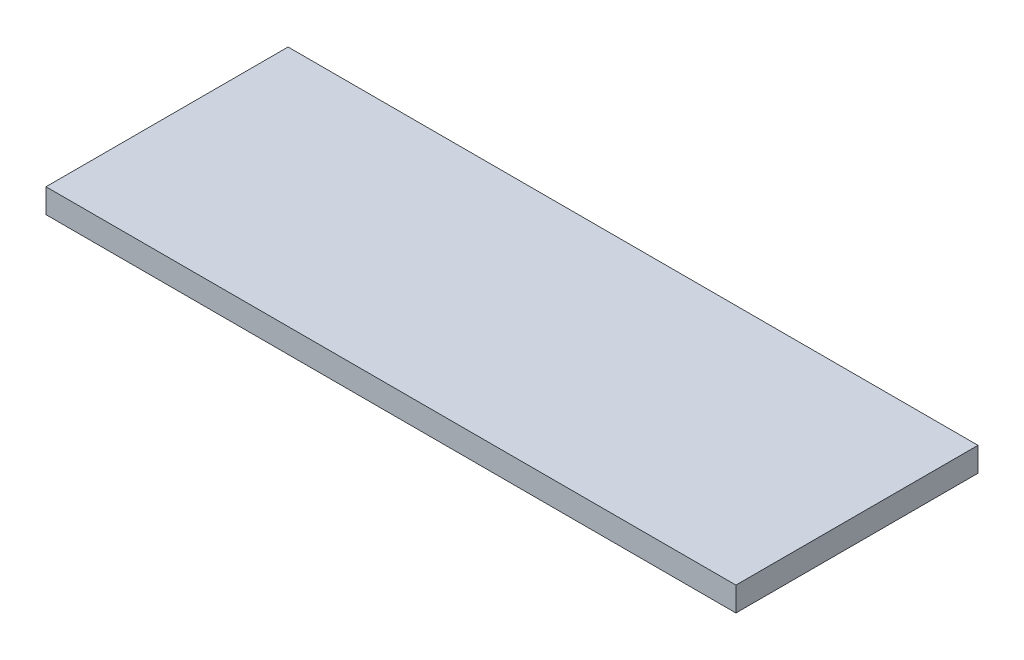
ISO-10303-21;
HEADER;
FILE_DESCRIPTION(('STEP AP214'),'2;1');
FILE_NAME('part.step','',(''),(''),'','','');
FILE_SCHEMA(('AUTOMOTIVE_DESIGN { 1 0 10303 214 1 1 1 1 }'));
ENDSEC;
DATA;
#1=APPLICATION_CONTEXT('core data for automotive mechanical design processes');
#2=APPLICATION_PROTOCOL_DEFINITION('international standard','automotive_design',2000,#1);
#3=PRODUCT_CONTEXT('',#1,'mechanical');
#4=PRODUCT('Part','Part','',(#3));
#5=PRODUCT_RELATED_PRODUCT_CATEGORY('part','',(#4));
#6=PRODUCT_DEFINITION_FORMATION('','',#4);
#7=PRODUCT_DEFINITION_CONTEXT('part definition',#1,'design');
#8=PRODUCT_DEFINITION('design','',#6,#7);
#9=PRODUCT_DEFINITION_SHAPE('','',#8);
#10=(LENGTH_UNIT() NAMED_UNIT(*) SI_UNIT(.MILLI.,.METRE.));
#11=(NAMED_UNIT(*) PLANE_ANGLE_UNIT() SI_UNIT($,.RADIAN.));
#12=(NAMED_UNIT(*) SI_UNIT($,.STERADIAN.) SOLID_ANGLE_UNIT());
#13=UNCERTAINTY_MEASURE_WITH_UNIT(LENGTH_MEASURE(1.E-05),#10,'distance_accuracy_value','');
#14=(GEOMETRIC_REPRESENTATION_CONTEXT(3) GLOBAL_UNCERTAINTY_ASSIGNED_CONTEXT((#13)) GLOBAL_UNIT_ASSIGNED_CONTEXT((#10,
#11,#12)) REPRESENTATION_CONTEXT('',''));
#15=CARTESIAN_POINT('',(0.,0.,0.));
#16=DIRECTION('',(0.,0.,1.));
#17=DIRECTION('',(1.,0.,0.));
#18=AXIS2_PLACEMENT_3D('',#15,#16,#17);
#19=CARTESIAN_POINT('',(-15.8111111111111,14.3555555555555,5.25));
#20=DIRECTION('',(1.,0.,0.));
#21=DIRECTION('',(0.,1.,0.));
#22=AXIS2_PLACEMENT_3D('',#19,#20,#21);
#23=PLANE('',#22);
#24=DIRECTION('',(0.,0.,-1.));
#25=VECTOR('',#24,1.);
#26=CARTESIAN_POINT('',(-15.8111111111111,15.3555555555555,5.25));
#27=LINE('',#26,#25);
#28=CARTESIAN_POINT('',(-15.8111111111111,15.3555555555555,5.25));
#29=VERTEX_POINT('',#28);
#30=CARTESIAN_POINT('',(-15.8111111111111,15.3555555555556,-4.75));
#31=VERTEX_POINT('',#30);
#32=EDGE_CURVE('E98',#29,#31,#27,.T.);
#33=ORIENTED_EDGE('',*,*,#32,.T.);
#34=DIRECTION('',(0.,1.,0.));
#35=VECTOR('',#34,1.);
#36=CARTESIAN_POINT('',(-15.8111111111111,14.3555555555556,-4.75));
#37=LINE('',#36,#35);
#38=CARTESIAN_POINT('',(-15.8111111111111,14.3555555555556,-4.75));
#39=VERTEX_POINT('',#38);
#40=EDGE_CURVE('E11',#39,#31,#37,.T.);
#41=ORIENTED_EDGE('',*,*,#40,.F.);
#42=DIRECTION('',(0.,0.,-1.));
#43=VECTOR('',#42,1.);
#44=CARTESIAN_POINT('',(-15.8111111111111,14.3555555555555,5.25));
#45=LINE('',#44,#43);
#46=CARTESIAN_POINT('',(-15.8111111111111,14.3555555555555,5.25));
#47=VERTEX_POINT('',#46);
#48=EDGE_CURVE('E86',#47,#39,#45,.T.);
#49=ORIENTED_EDGE('',*,*,#48,.F.);
#50=DIRECTION('',(0.,1.,0.));
#51=VECTOR('',#50,1.);
#52=CARTESIAN_POINT('',(-15.8111111111111,14.3555555555555,5.25));
#53=LINE('',#52,#51);
#54=EDGE_CURVE('E94',#47,#29,#53,.T.);
#55=ORIENTED_EDGE('',*,*,#54,.T.);
#56=EDGE_LOOP('',(#33,#41,#49,#55));
#57=FACE_BOUND('',#56,.T.);
#58=ADVANCED_FACE('F35',(#57),#23,.F.);
#59=CARTESIAN_POINT('',(-15.8111111111111,14.3555555555556,-4.75));
#60=DIRECTION('',(0.,0.,1.));
#61=DIRECTION('',(0.,-1.,0.));
#62=AXIS2_PLACEMENT_3D('',#59,#60,#61);
#63=PLANE('',#62);
#64=DIRECTION('',(1.,0.,0.));
#65=VECTOR('',#64,1.);
#66=CARTESIAN_POINT('',(-15.8111111111111,15.3555555555556,-4.75));
#67=LINE('',#66,#65);
#68=CARTESIAN_POINT('',(12.6888888888889,15.3555555555556,-4.75));
#69=VERTEX_POINT('',#68);
#70=EDGE_CURVE('E90',#31,#69,#67,.T.);
#71=ORIENTED_EDGE('',*,*,#70,.T.);
#72=DIRECTION('',(0.,1.,0.));
#73=VECTOR('',#72,1.);
#74=CARTESIAN_POINT('',(12.6888888888889,14.3555555555556,-4.75));
#75=LINE('',#74,#73);
#76=CARTESIAN_POINT('',(12.6888888888889,14.3555555555556,-4.75));
#77=VERTEX_POINT('',#76);
#78=EDGE_CURVE('E43',#77,#69,#75,.T.);
#79=ORIENTED_EDGE('',*,*,#78,.F.);
#80=DIRECTION('',(1.,0.,0.));
#81=VECTOR('',#80,1.);
#82=CARTESIAN_POINT('',(-15.8111111111111,14.3555555555556,-4.75));
#83=LINE('',#82,#81);
#84=EDGE_CURVE('E81',#39,#77,#83,.T.);
#85=ORIENTED_EDGE('',*,*,#84,.F.);
#86=ORIENTED_EDGE('',*,*,#40,.T.);
#87=EDGE_LOOP('',(#71,#79,#85,#86));
#88=FACE_BOUND('',#87,.T.);
#89=ADVANCED_FACE('F89',(#88),#63,.F.);
#90=CARTESIAN_POINT('',(12.6888888888889,14.3555555555555,5.25));
#91=DIRECTION('',(-1.,0.,0.));
#92=DIRECTION('',(0.,0.,-1.));
#93=AXIS2_PLACEMENT_3D('',#90,#91,#92);
#94=PLANE('',#93);
#95=DIRECTION('',(0.,0.,1.));
#96=VECTOR('',#95,1.);
#97=CARTESIAN_POINT('',(12.6888888888889,15.3555555555555,5.25));
#98=LINE('',#97,#96);
#99=CARTESIAN_POINT('',(12.6888888888889,15.3555555555555,5.25));
#100=VERTEX_POINT('',#99);
#101=EDGE_CURVE('E68',#69,#100,#98,.T.);
#102=ORIENTED_EDGE('',*,*,#101,.T.);
#103=DIRECTION('',(0.,1.,0.));
#104=VECTOR('',#103,1.);
#105=CARTESIAN_POINT('',(12.6888888888889,14.3555555555555,5.25));
#106=LINE('',#105,#104);
#107=CARTESIAN_POINT('',(12.6888888888889,14.3555555555555,5.25));
#108=VERTEX_POINT('',#107);
#109=EDGE_CURVE('E91',#108,#100,#106,.T.);
#110=ORIENTED_EDGE('',*,*,#109,.F.);
#111=DIRECTION('',(0.,0.,1.));
#112=VECTOR('',#111,1.);
#113=CARTESIAN_POINT('',(12.6888888888889,14.3555555555555,5.25));
#114=LINE('',#113,#112);
#115=EDGE_CURVE('E84',#77,#108,#114,.T.);
#116=ORIENTED_EDGE('',*,*,#115,.F.);
#117=ORIENTED_EDGE('',*,*,#78,.T.);
#118=EDGE_LOOP('',(#102,#110,#116,#117));
#119=FACE_BOUND('',#118,.T.);
#120=ADVANCED_FACE('F92',(#119),#94,.F.);
#121=CARTESIAN_POINT('',(-15.8111111111111,14.3555555555555,5.25));
#122=DIRECTION('',(0.,0.,-1.));
#123=DIRECTION('',(0.,1.,0.));
#124=AXIS2_PLACEMENT_3D('',#121,#122,#123);
#125=PLANE('',#124);
#126=DIRECTION('',(-1.,0.,0.));
#127=VECTOR('',#126,1.);
#128=CARTESIAN_POINT('',(-15.8111111111111,15.3555555555555,5.25));
#129=LINE('',#128,#127);
#130=EDGE_CURVE('E74',#100,#29,#129,.T.);
#131=ORIENTED_EDGE('',*,*,#130,.T.);
#132=ORIENTED_EDGE('',*,*,#54,.F.);
#133=DIRECTION('',(-1.,0.,0.));
#134=VECTOR('',#133,1.);
#135=CARTESIAN_POINT('',(-15.8111111111111,14.3555555555555,5.25));
#136=LINE('',#135,#134);
#137=EDGE_CURVE('E51',#108,#47,#136,.T.);
#138=ORIENTED_EDGE('',*,*,#137,.F.);
#139=ORIENTED_EDGE('',*,*,#109,.T.);
#140=EDGE_LOOP('',(#131,#132,#138,#139));
#141=FACE_BOUND('',#140,.T.);
#142=ADVANCED_FACE('F105',(#141),#125,.F.);
#143=CARTESIAN_POINT('',(0.,14.3555555555556,-14.8555555555556));
#144=DIRECTION('',(0.,-1.,0.));
#145=DIRECTION('',(1.,0.,0.));
#146=AXIS2_PLACEMENT_3D('',#143,#144,#145);
#147=PLANE('',#146);
#148=ORIENTED_EDGE('',*,*,#48,.T.);
#149=ORIENTED_EDGE('',*,*,#84,.T.);
#150=ORIENTED_EDGE('',*,*,#115,.T.);
#151=ORIENTED_EDGE('',*,*,#137,.T.);
#152=EDGE_LOOP('',(#148,#149,#150,#151));
#153=FACE_BOUND('',#152,.T.);
#154=ADVANCED_FACE('F82',(#153),#147,.T.);
#155=CARTESIAN_POINT('',(0.,15.3555555555556,-14.8555555555555));
#156=DIRECTION('',(0.,-1.,0.));
#157=DIRECTION('',(1.,0.,0.));
#158=AXIS2_PLACEMENT_3D('',#155,#156,#157);
#159=PLANE('',#158);
#160=ORIENTED_EDGE('',*,*,#32,.F.);
#161=ORIENTED_EDGE('',*,*,#130,.F.);
#162=ORIENTED_EDGE('',*,*,#101,.F.);
#163=ORIENTED_EDGE('',*,*,#70,.F.);
#164=EDGE_LOOP('',(#160,#161,#162,#163));
#165=FACE_BOUND('',#164,.T.);
#166=ADVANCED_FACE('F108',(#165),#159,.F.);
#167=CLOSED_SHELL('',(#58,#89,#120,#142,#154,#166));
#168=MANIFOLD_SOLID_BREP('B2',#167);
#169=ADVANCED_BREP_SHAPE_REPRESENTATION('',(#18,#168),#14);
#170=SHAPE_DEFINITION_REPRESENTATION(#9,#169);
ENDSEC;
END-ISO-10303-21;
